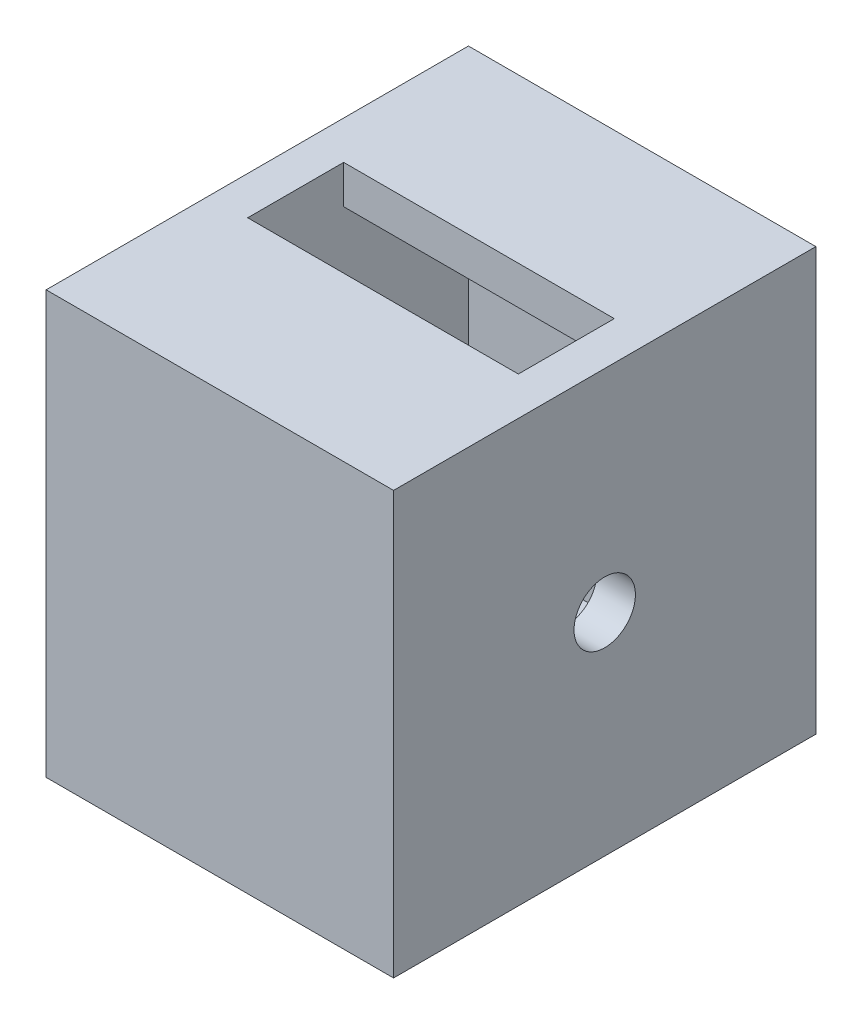
ISO-10303-21;
HEADER;
FILE_DESCRIPTION(('STEP AP214'),'2;1');
FILE_NAME('part.step','',(''),(''),'','','');
FILE_SCHEMA(('AUTOMOTIVE_DESIGN { 1 0 10303 214 1 1 1 1 }'));
ENDSEC;
DATA;
#1=APPLICATION_CONTEXT('core data for automotive mechanical design processes');
#2=APPLICATION_PROTOCOL_DEFINITION('international standard','automotive_design',2000,#1);
#3=PRODUCT_CONTEXT('',#1,'mechanical');
#4=PRODUCT('Part','Part','',(#3));
#5=PRODUCT_RELATED_PRODUCT_CATEGORY('part','',(#4));
#6=PRODUCT_DEFINITION_FORMATION('','',#4);
#7=PRODUCT_DEFINITION_CONTEXT('part definition',#1,'design');
#8=PRODUCT_DEFINITION('design','',#6,#7);
#9=PRODUCT_DEFINITION_SHAPE('','',#8);
#10=(LENGTH_UNIT() NAMED_UNIT(*) SI_UNIT(.MILLI.,.METRE.));
#11=(NAMED_UNIT(*) PLANE_ANGLE_UNIT() SI_UNIT($,.RADIAN.));
#12=(NAMED_UNIT(*) SI_UNIT($,.STERADIAN.) SOLID_ANGLE_UNIT());
#13=UNCERTAINTY_MEASURE_WITH_UNIT(LENGTH_MEASURE(1.E-05),#10,'distance_accuracy_value','');
#14=(GEOMETRIC_REPRESENTATION_CONTEXT(3) GLOBAL_UNCERTAINTY_ASSIGNED_CONTEXT((#13)) GLOBAL_UNIT_ASSIGNED_CONTEXT((#10,
#11,#12)) REPRESENTATION_CONTEXT('',''));
#15=CARTESIAN_POINT('',(0.,0.,0.));
#16=DIRECTION('',(0.,0.,1.));
#17=DIRECTION('',(1.,0.,0.));
#18=AXIS2_PLACEMENT_3D('',#15,#16,#17);
#19=CARTESIAN_POINT('',(8.9535,13.97,-11.43));
#20=DIRECTION('',(0.,0.,1.));
#21=DIRECTION('',(1.,0.,0.));
#22=AXIS2_PLACEMENT_3D('',#19,#20,#21);
#23=PLANE('',#22);
#24=DIRECTION('',(0.,1.,0.));
#25=VECTOR('',#24,1.);
#26=CARTESIAN_POINT('',(2.6035,-3.17499999999999,-11.43));
#27=LINE('',#26,#25);
#28=CARTESIAN_POINT('',(2.6035,-3.17499999999999,-11.43));
#29=VERTEX_POINT('',#28);
#30=CARTESIAN_POINT('',(2.6035,3.17500000000001,-11.43));
#31=VERTEX_POINT('',#30);
#32=EDGE_CURVE('E174',#29,#31,#27,.T.);
#33=ORIENTED_EDGE('',*,*,#32,.T.);
#34=DIRECTION('',(-1.,0.,0.));
#35=VECTOR('',#34,1.);
#36=CARTESIAN_POINT('',(5.7785,3.17500000000001,-11.43));
#37=LINE('',#36,#35);
#38=CARTESIAN_POINT('',(5.7785,3.17500000000001,-11.43));
#39=VERTEX_POINT('',#38);
#40=EDGE_CURVE('E158',#39,#31,#37,.T.);
#41=ORIENTED_EDGE('',*,*,#40,.F.);
#42=DIRECTION('',(0.,1.,0.));
#43=VECTOR('',#42,1.);
#44=CARTESIAN_POINT('',(5.7785,-3.17499999999999,-11.43));
#45=LINE('',#44,#43);
#46=CARTESIAN_POINT('',(5.7785,-3.17499999999999,-11.43));
#47=VERTEX_POINT('',#46);
#48=EDGE_CURVE('E170',#47,#39,#45,.T.);
#49=ORIENTED_EDGE('',*,*,#48,.F.);
#50=DIRECTION('',(-1.,0.,0.));
#51=VECTOR('',#50,1.);
#52=CARTESIAN_POINT('',(5.7785,-3.17499999999999,-11.43));
#53=LINE('',#52,#51);
#54=EDGE_CURVE('E182',#47,#29,#53,.T.);
#55=ORIENTED_EDGE('',*,*,#54,.T.);
#56=EDGE_LOOP('',(#33,#41,#49,#55));
#57=FACE_BOUND('',#56,.T.);
#58=DIRECTION('',(0.,-1.,0.));
#59=VECTOR('',#58,1.);
#60=CARTESIAN_POINT('',(8.9535,13.97,-11.43));
#61=LINE('',#60,#59);
#62=CARTESIAN_POINT('',(8.9535,11.43,-11.43));
#63=VERTEX_POINT('',#62);
#64=CARTESIAN_POINT('',(8.9535,-11.43,-11.43));
#65=VERTEX_POINT('',#64);
#66=EDGE_CURVE('E288',#63,#65,#61,.T.);
#67=ORIENTED_EDGE('',*,*,#66,.F.);
#68=DIRECTION('',(-1.,0.,0.));
#69=VECTOR('',#68,1.);
#70=CARTESIAN_POINT('',(-8.9535,11.43,-11.43));
#71=LINE('',#70,#69);
#72=CARTESIAN_POINT('',(-8.9535,11.43,-11.43));
#73=VERTEX_POINT('',#72);
#74=EDGE_CURVE('E244',#63,#73,#71,.T.);
#75=ORIENTED_EDGE('',*,*,#74,.T.);
#76=DIRECTION('',(0.,-1.,0.));
#77=VECTOR('',#76,1.);
#78=CARTESIAN_POINT('',(-8.9535,13.97,-11.43));
#79=LINE('',#78,#77);
#80=CARTESIAN_POINT('',(-8.9535,-11.43,-11.43));
#81=VERTEX_POINT('',#80);
#82=EDGE_CURVE('E285',#73,#81,#79,.T.);
#83=ORIENTED_EDGE('',*,*,#82,.T.);
#84=DIRECTION('',(1.,0.,0.));
#85=VECTOR('',#84,1.);
#86=CARTESIAN_POINT('',(-8.9535,-11.43,-11.43));
#87=LINE('',#86,#85);
#88=EDGE_CURVE('E261',#81,#65,#87,.T.);
#89=ORIENTED_EDGE('',*,*,#88,.T.);
#90=EDGE_LOOP('',(#67,#75,#83,#89));
#91=FACE_BOUND('',#90,.T.);
#92=ADVANCED_FACE('F43',(#57,#91),#23,.T.);
#93=CARTESIAN_POINT('',(8.9535,13.97,-11.43));
#94=DIRECTION('',(-1.,0.,0.));
#95=DIRECTION('',(0.,0.,1.));
#96=AXIS2_PLACEMENT_3D('',#93,#94,#95);
#97=PLANE('',#96);
#98=CARTESIAN_POINT('',(8.9535,0.,0.));
#99=DIRECTION('',(-1.,0.,0.));
#100=DIRECTION('',(0.,0.,1.));
#101=AXIS2_PLACEMENT_3D('',#98,#99,#100);
#102=CIRCLE('',#101,2.032);
#103=CARTESIAN_POINT('',(8.9535,0.,2.03199999999999));
#104=VERTEX_POINT('',#103);
#105=EDGE_CURVE('E205',#104,#104,#102,.F.);
#106=ORIENTED_EDGE('',*,*,#105,.T.);
#107=EDGE_LOOP('',(#106));
#108=FACE_BOUND('',#107,.T.);
#109=DIRECTION('',(0.,1.,0.));
#110=VECTOR('',#109,1.);
#111=CARTESIAN_POINT('',(8.9535,11.43,3.175));
#112=LINE('',#111,#110);
#113=CARTESIAN_POINT('',(8.9535,11.43,3.175));
#114=VERTEX_POINT('',#113);
#115=CARTESIAN_POINT('',(8.9535,13.97,3.175));
#116=VERTEX_POINT('',#115);
#117=EDGE_CURVE('E210',#114,#116,#112,.T.);
#118=ORIENTED_EDGE('',*,*,#117,.T.);
#119=DIRECTION('',(0.,0.,-1.));
#120=VECTOR('',#119,1.);
#121=CARTESIAN_POINT('',(8.9535,13.97,-11.43));
#122=LINE('',#121,#120);
#123=CARTESIAN_POINT('',(8.9535,13.97,-3.175));
#124=VERTEX_POINT('',#123);
#125=EDGE_CURVE('E273',#116,#124,#122,.T.);
#126=ORIENTED_EDGE('',*,*,#125,.T.);
#127=DIRECTION('',(0.,1.,0.));
#128=VECTOR('',#127,1.);
#129=CARTESIAN_POINT('',(8.9535,11.43,-3.175));
#130=LINE('',#129,#128);
#131=CARTESIAN_POINT('',(8.9535,11.43,-3.175));
#132=VERTEX_POINT('',#131);
#133=EDGE_CURVE('E251',#132,#124,#130,.T.);
#134=ORIENTED_EDGE('',*,*,#133,.F.);
#135=DIRECTION('',(0.,0.,-1.));
#136=VECTOR('',#135,1.);
#137=CARTESIAN_POINT('',(8.9535,11.43,-11.43));
#138=LINE('',#137,#136);
#139=EDGE_CURVE('E241',#132,#63,#138,.T.);
#140=ORIENTED_EDGE('',*,*,#139,.T.);
#141=ORIENTED_EDGE('',*,*,#66,.T.);
#142=DIRECTION('',(0.,0.,1.));
#143=VECTOR('',#142,1.);
#144=CARTESIAN_POINT('',(8.9535,-11.43,11.43));
#145=LINE('',#144,#143);
#146=CARTESIAN_POINT('',(8.9535,-11.43,11.43));
#147=VERTEX_POINT('',#146);
#148=EDGE_CURVE('E265',#65,#147,#145,.T.);
#149=ORIENTED_EDGE('',*,*,#148,.T.);
#150=DIRECTION('',(0.,-1.,0.));
#151=VECTOR('',#150,1.);
#152=CARTESIAN_POINT('',(8.9535,13.97,11.43));
#153=LINE('',#152,#151);
#154=CARTESIAN_POINT('',(8.9535,11.43,11.43));
#155=VERTEX_POINT('',#154);
#156=EDGE_CURVE('E279',#155,#147,#153,.T.);
#157=ORIENTED_EDGE('',*,*,#156,.F.);
#158=DIRECTION('',(0.,0.,-1.));
#159=VECTOR('',#158,1.);
#160=CARTESIAN_POINT('',(8.9535,11.43,11.43));
#161=LINE('',#160,#159);
#162=EDGE_CURVE('E226',#155,#114,#161,.T.);
#163=ORIENTED_EDGE('',*,*,#162,.T.);
#164=EDGE_LOOP('',(#118,#126,#134,#140,#141,#149,#157,#163));
#165=FACE_BOUND('',#164,.T.);
#166=ADVANCED_FACE('F356',(#108,#165),#97,.T.);
#167=CARTESIAN_POINT('',(-8.9535,13.97,-11.43));
#168=DIRECTION('',(1.,0.,0.));
#169=DIRECTION('',(0.,0.,-1.));
#170=AXIS2_PLACEMENT_3D('',#167,#168,#169);
#171=PLANE('',#170);
#172=DIRECTION('',(0.,1.,0.));
#173=VECTOR('',#172,1.);
#174=CARTESIAN_POINT('',(-8.9535,11.43,3.175));
#175=LINE('',#174,#173);
#176=CARTESIAN_POINT('',(-8.9535,11.43,3.175));
#177=VERTEX_POINT('',#176);
#178=CARTESIAN_POINT('',(-8.9535,13.97,3.175));
#179=VERTEX_POINT('',#178);
#180=EDGE_CURVE('E209',#177,#179,#175,.T.);
#181=ORIENTED_EDGE('',*,*,#180,.F.);
#182=DIRECTION('',(0.,0.,1.));
#183=VECTOR('',#182,1.);
#184=CARTESIAN_POINT('',(-8.9535,11.43,11.43));
#185=LINE('',#184,#183);
#186=CARTESIAN_POINT('',(-8.9535,11.43,11.43));
#187=VERTEX_POINT('',#186);
#188=EDGE_CURVE('E222',#177,#187,#185,.T.);
#189=ORIENTED_EDGE('',*,*,#188,.T.);
#190=DIRECTION('',(0.,-1.,0.));
#191=VECTOR('',#190,1.);
#192=CARTESIAN_POINT('',(-8.9535,13.97,11.43));
#193=LINE('',#192,#191);
#194=CARTESIAN_POINT('',(-8.9535,-11.43,11.43));
#195=VERTEX_POINT('',#194);
#196=EDGE_CURVE('E282',#187,#195,#193,.T.);
#197=ORIENTED_EDGE('',*,*,#196,.T.);
#198=DIRECTION('',(0.,0.,-1.));
#199=VECTOR('',#198,1.);
#200=CARTESIAN_POINT('',(-8.9535,-11.43,11.43));
#201=LINE('',#200,#199);
#202=EDGE_CURVE('E255',#195,#81,#201,.T.);
#203=ORIENTED_EDGE('',*,*,#202,.T.);
#204=ORIENTED_EDGE('',*,*,#82,.F.);
#205=DIRECTION('',(0.,0.,1.));
#206=VECTOR('',#205,1.);
#207=CARTESIAN_POINT('',(-8.9535,11.43,-11.43));
#208=LINE('',#207,#206);
#209=CARTESIAN_POINT('',(-8.9535,11.43,-3.175));
#210=VERTEX_POINT('',#209);
#211=EDGE_CURVE('E234',#73,#210,#208,.T.);
#212=ORIENTED_EDGE('',*,*,#211,.T.);
#213=DIRECTION('',(0.,1.,0.));
#214=VECTOR('',#213,1.);
#215=CARTESIAN_POINT('',(-8.9535,11.43,-3.175));
#216=LINE('',#215,#214);
#217=CARTESIAN_POINT('',(-8.9535,13.97,-3.175));
#218=VERTEX_POINT('',#217);
#219=EDGE_CURVE('E247',#210,#218,#216,.T.);
#220=ORIENTED_EDGE('',*,*,#219,.T.);
#221=DIRECTION('',(0.,0.,1.));
#222=VECTOR('',#221,1.);
#223=CARTESIAN_POINT('',(-8.9535,13.97,-11.43));
#224=LINE('',#223,#222);
#225=EDGE_CURVE('E276',#218,#179,#224,.T.);
#226=ORIENTED_EDGE('',*,*,#225,.T.);
#227=EDGE_LOOP('',(#181,#189,#197,#203,#204,#212,#220,#226));
#228=FACE_BOUND('',#227,.T.);
#229=ADVANCED_FACE('F361',(#228),#171,.T.);
#230=CARTESIAN_POINT('',(8.9535,13.97,11.43));
#231=DIRECTION('',(0.,0.,-1.));
#232=DIRECTION('',(-1.,0.,0.));
#233=AXIS2_PLACEMENT_3D('',#230,#231,#232);
#234=PLANE('',#233);
#235=DIRECTION('',(1.,0.,0.));
#236=VECTOR('',#235,1.);
#237=CARTESIAN_POINT('',(-8.9535,11.43,11.43));
#238=LINE('',#237,#236);
#239=EDGE_CURVE('E229',#187,#155,#238,.T.);
#240=ORIENTED_EDGE('',*,*,#239,.T.);
#241=ORIENTED_EDGE('',*,*,#156,.T.);
#242=DIRECTION('',(-1.,0.,0.));
#243=VECTOR('',#242,1.);
#244=CARTESIAN_POINT('',(-8.9535,-11.43,11.43));
#245=LINE('',#244,#243);
#246=EDGE_CURVE('E269',#147,#195,#245,.T.);
#247=ORIENTED_EDGE('',*,*,#246,.T.);
#248=ORIENTED_EDGE('',*,*,#196,.F.);
#249=EDGE_LOOP('',(#240,#241,#247,#248));
#250=FACE_BOUND('',#249,.T.);
#251=ADVANCED_FACE('F369',(#250),#234,.T.);
#252=CARTESIAN_POINT('',(0.,13.97,0.));
#253=DIRECTION('',(0.,-1.,0.));
#254=DIRECTION('',(0.,0.,-1.));
#255=AXIS2_PLACEMENT_3D('',#252,#253,#254);
#256=PLANE('',#255);
#257=ORIENTED_EDGE('',*,*,#125,.F.);
#258=DIRECTION('',(-1.,0.,0.));
#259=VECTOR('',#258,1.);
#260=CARTESIAN_POINT('',(-8.9535,13.97,3.175));
#261=LINE('',#260,#259);
#262=EDGE_CURVE('E217',#116,#179,#261,.T.);
#263=ORIENTED_EDGE('',*,*,#262,.T.);
#264=ORIENTED_EDGE('',*,*,#225,.F.);
#265=DIRECTION('',(1.,0.,0.));
#266=VECTOR('',#265,1.);
#267=CARTESIAN_POINT('',(-8.9535,13.97,-3.175));
#268=LINE('',#267,#266);
#269=EDGE_CURVE('E221',#218,#124,#268,.T.);
#270=ORIENTED_EDGE('',*,*,#269,.T.);
#271=EDGE_LOOP('',(#257,#263,#264,#270));
#272=FACE_BOUND('',#271,.T.);
#273=DIRECTION('',(0.,0.,-1.));
#274=VECTOR('',#273,1.);
#275=CARTESIAN_POINT('',(11.4935,13.97,-13.97));
#276=LINE('',#275,#274);
#277=CARTESIAN_POINT('',(11.4935,13.97,13.97));
#278=VERTEX_POINT('',#277);
#279=CARTESIAN_POINT('',(11.4935,13.97,-13.97));
#280=VERTEX_POINT('',#279);
#281=EDGE_CURVE('E292',#278,#280,#276,.T.);
#282=ORIENTED_EDGE('',*,*,#281,.T.);
#283=DIRECTION('',(-1.,0.,0.));
#284=VECTOR('',#283,1.);
#285=CARTESIAN_POINT('',(11.4935,13.97,-13.97));
#286=LINE('',#285,#284);
#287=CARTESIAN_POINT('',(-11.4935,13.97,-13.97));
#288=VERTEX_POINT('',#287);
#289=EDGE_CURVE('E296',#280,#288,#286,.T.);
#290=ORIENTED_EDGE('',*,*,#289,.T.);
#291=DIRECTION('',(0.,0.,1.));
#292=VECTOR('',#291,1.);
#293=CARTESIAN_POINT('',(-11.4935,13.97,-13.97));
#294=LINE('',#293,#292);
#295=CARTESIAN_POINT('',(-11.4935,13.97,13.97));
#296=VERTEX_POINT('',#295);
#297=EDGE_CURVE('E300',#288,#296,#294,.T.);
#298=ORIENTED_EDGE('',*,*,#297,.T.);
#299=DIRECTION('',(1.,0.,0.));
#300=VECTOR('',#299,1.);
#301=CARTESIAN_POINT('',(11.4935,13.97,13.97));
#302=LINE('',#301,#300);
#303=EDGE_CURVE('E303',#296,#278,#302,.T.);
#304=ORIENTED_EDGE('',*,*,#303,.T.);
#305=EDGE_LOOP('',(#282,#290,#298,#304));
#306=FACE_BOUND('',#305,.T.);
#307=ADVANCED_FACE('F345',(#272,#306),#256,.F.);
#308=CARTESIAN_POINT('',(0.,-13.97,0.));
#309=DIRECTION('',(0.,-1.,0.));
#310=DIRECTION('',(0.,0.,-1.));
#311=AXIS2_PLACEMENT_3D('',#308,#309,#310);
#312=PLANE('',#311);
#313=DIRECTION('',(0.,0.,-1.));
#314=VECTOR('',#313,1.);
#315=CARTESIAN_POINT('',(11.4935,-13.97,-13.97));
#316=LINE('',#315,#314);
#317=CARTESIAN_POINT('',(11.4935,-13.97,13.97));
#318=VERTEX_POINT('',#317);
#319=CARTESIAN_POINT('',(11.4935,-13.97,-13.97));
#320=VERTEX_POINT('',#319);
#321=EDGE_CURVE('E291',#318,#320,#316,.T.);
#322=ORIENTED_EDGE('',*,*,#321,.F.);
#323=DIRECTION('',(1.,0.,0.));
#324=VECTOR('',#323,1.);
#325=CARTESIAN_POINT('',(11.4935,-13.97,13.97));
#326=LINE('',#325,#324);
#327=CARTESIAN_POINT('',(-11.4935,-13.97,13.97));
#328=VERTEX_POINT('',#327);
#329=EDGE_CURVE('E297',#328,#318,#326,.T.);
#330=ORIENTED_EDGE('',*,*,#329,.F.);
#331=DIRECTION('',(0.,0.,1.));
#332=VECTOR('',#331,1.);
#333=CARTESIAN_POINT('',(-11.4935,-13.97,-13.97));
#334=LINE('',#333,#332);
#335=CARTESIAN_POINT('',(-11.4935,-13.97,-13.97));
#336=VERTEX_POINT('',#335);
#337=EDGE_CURVE('E313',#336,#328,#334,.T.);
#338=ORIENTED_EDGE('',*,*,#337,.F.);
#339=DIRECTION('',(-1.,0.,0.));
#340=VECTOR('',#339,1.);
#341=CARTESIAN_POINT('',(11.4935,-13.97,-13.97));
#342=LINE('',#341,#340);
#343=EDGE_CURVE('E310',#320,#336,#342,.T.);
#344=ORIENTED_EDGE('',*,*,#343,.F.);
#345=EDGE_LOOP('',(#322,#330,#338,#344));
#346=FACE_BOUND('',#345,.T.);
#347=ADVANCED_FACE('F336',(#346),#312,.T.);
#348=CARTESIAN_POINT('',(11.4935,13.97,-13.97));
#349=DIRECTION('',(-1.,0.,0.));
#350=DIRECTION('',(0.,0.,1.));
#351=AXIS2_PLACEMENT_3D('',#348,#349,#350);
#352=PLANE('',#351);
#353=CARTESIAN_POINT('',(11.4935,0.,0.));
#354=DIRECTION('',(1.,0.,0.));
#355=DIRECTION('',(0.,0.,-1.));
#356=AXIS2_PLACEMENT_3D('',#353,#354,#355);
#357=CIRCLE('',#356,2.032);
#358=CARTESIAN_POINT('',(11.4935,0.,-2.03200000000001));
#359=VERTEX_POINT('',#358);
#360=EDGE_CURVE('E201',#359,#359,#357,.T.);
#361=ORIENTED_EDGE('',*,*,#360,.F.);
#362=EDGE_LOOP('',(#361));
#363=FACE_BOUND('',#362,.T.);
#364=ORIENTED_EDGE('',*,*,#321,.T.);
#365=DIRECTION('',(0.,-1.,0.));
#366=VECTOR('',#365,1.);
#367=CARTESIAN_POINT('',(11.4935,13.97,-13.97));
#368=LINE('',#367,#366);
#369=EDGE_CURVE('E11',#280,#320,#368,.T.);
#370=ORIENTED_EDGE('',*,*,#369,.F.);
#371=ORIENTED_EDGE('',*,*,#281,.F.);
#372=DIRECTION('',(0.,-1.,0.));
#373=VECTOR('',#372,1.);
#374=CARTESIAN_POINT('',(11.4935,13.97,13.97));
#375=LINE('',#374,#373);
#376=EDGE_CURVE('E306',#278,#318,#375,.T.);
#377=ORIENTED_EDGE('',*,*,#376,.T.);
#378=EDGE_LOOP('',(#364,#370,#371,#377));
#379=FACE_BOUND('',#378,.T.);
#380=ADVANCED_FACE('F45',(#363,#379),#352,.F.);
#381=CARTESIAN_POINT('',(11.4935,13.97,-13.97));
#382=DIRECTION('',(0.,0.,1.));
#383=DIRECTION('',(1.,0.,0.));
#384=AXIS2_PLACEMENT_3D('',#381,#382,#383);
#385=PLANE('',#384);
#386=DIRECTION('',(-1.,0.,0.));
#387=VECTOR('',#386,1.);
#388=CARTESIAN_POINT('',(5.7785,3.17500000000001,-13.97));
#389=LINE('',#388,#387);
#390=CARTESIAN_POINT('',(5.7785,3.17500000000001,-13.97));
#391=VERTEX_POINT('',#390);
#392=CARTESIAN_POINT('',(2.6035,3.17500000000001,-13.97));
#393=VERTEX_POINT('',#392);
#394=EDGE_CURVE('E196',#391,#393,#389,.T.);
#395=ORIENTED_EDGE('',*,*,#394,.T.);
#396=DIRECTION('',(0.,1.,0.));
#397=VECTOR('',#396,1.);
#398=CARTESIAN_POINT('',(2.6035,-3.17499999999999,-13.97));
#399=LINE('',#398,#397);
#400=CARTESIAN_POINT('',(2.6035,-3.17499999999999,-13.97));
#401=VERTEX_POINT('',#400);
#402=EDGE_CURVE('E177',#401,#393,#399,.T.);
#403=ORIENTED_EDGE('',*,*,#402,.F.);
#404=DIRECTION('',(-1.,0.,0.));
#405=VECTOR('',#404,1.);
#406=CARTESIAN_POINT('',(5.7785,-3.17499999999999,-13.97));
#407=LINE('',#406,#405);
#408=CARTESIAN_POINT('',(5.7785,-3.17499999999999,-13.97));
#409=VERTEX_POINT('',#408);
#410=EDGE_CURVE('E169',#409,#401,#407,.T.);
#411=ORIENTED_EDGE('',*,*,#410,.F.);
#412=DIRECTION('',(0.,1.,0.));
#413=VECTOR('',#412,1.);
#414=CARTESIAN_POINT('',(5.7785,-3.17499999999999,-13.97));
#415=LINE('',#414,#413);
#416=EDGE_CURVE('E67',#409,#391,#415,.T.);
#417=ORIENTED_EDGE('',*,*,#416,.T.);
#418=EDGE_LOOP('',(#395,#403,#411,#417));
#419=FACE_BOUND('',#418,.T.);
#420=ORIENTED_EDGE('',*,*,#343,.T.);
#421=DIRECTION('',(0.,-1.,0.));
#422=VECTOR('',#421,1.);
#423=CARTESIAN_POINT('',(-11.4935,13.97,-13.97));
#424=LINE('',#423,#422);
#425=EDGE_CURVE('E52',#288,#336,#424,.T.);
#426=ORIENTED_EDGE('',*,*,#425,.F.);
#427=ORIENTED_EDGE('',*,*,#289,.F.);
#428=ORIENTED_EDGE('',*,*,#369,.T.);
#429=EDGE_LOOP('',(#420,#426,#427,#428));
#430=FACE_BOUND('',#429,.T.);
#431=ADVANCED_FACE('F346',(#419,#430),#385,.F.);
#432=CARTESIAN_POINT('',(-11.4935,13.97,-13.97));
#433=DIRECTION('',(1.,0.,0.));
#434=DIRECTION('',(0.,0.,-1.));
#435=AXIS2_PLACEMENT_3D('',#432,#433,#434);
#436=PLANE('',#435);
#437=ORIENTED_EDGE('',*,*,#337,.T.);
#438=DIRECTION('',(0.,-1.,0.));
#439=VECTOR('',#438,1.);
#440=CARTESIAN_POINT('',(-11.4935,13.97,13.97));
#441=LINE('',#440,#439);
#442=EDGE_CURVE('E321',#296,#328,#441,.T.);
#443=ORIENTED_EDGE('',*,*,#442,.F.);
#444=ORIENTED_EDGE('',*,*,#297,.F.);
#445=ORIENTED_EDGE('',*,*,#425,.T.);
#446=EDGE_LOOP('',(#437,#443,#444,#445));
#447=FACE_BOUND('',#446,.T.);
#448=ADVANCED_FACE('F330',(#447),#436,.F.);
#449=CARTESIAN_POINT('',(11.4935,13.97,13.97));
#450=DIRECTION('',(0.,0.,-1.));
#451=DIRECTION('',(-1.,0.,0.));
#452=AXIS2_PLACEMENT_3D('',#449,#450,#451);
#453=PLANE('',#452);
#454=ORIENTED_EDGE('',*,*,#329,.T.);
#455=ORIENTED_EDGE('',*,*,#376,.F.);
#456=ORIENTED_EDGE('',*,*,#303,.F.);
#457=ORIENTED_EDGE('',*,*,#442,.T.);
#458=EDGE_LOOP('',(#454,#455,#456,#457));
#459=FACE_BOUND('',#458,.T.);
#460=ADVANCED_FACE('F339',(#459),#453,.F.);
#461=CARTESIAN_POINT('',(0.,-11.43,0.));
#462=DIRECTION('',(0.,-1.,0.));
#463=DIRECTION('',(0.,0.,-1.));
#464=AXIS2_PLACEMENT_3D('',#461,#462,#463);
#465=PLANE('',#464);
#466=ORIENTED_EDGE('',*,*,#202,.F.);
#467=ORIENTED_EDGE('',*,*,#246,.F.);
#468=ORIENTED_EDGE('',*,*,#148,.F.);
#469=ORIENTED_EDGE('',*,*,#88,.F.);
#470=EDGE_LOOP('',(#466,#467,#468,#469));
#471=FACE_BOUND('',#470,.T.);
#472=ADVANCED_FACE('F374',(#471),#465,.F.);
#473=CARTESIAN_POINT('',(-8.9535,11.43,-3.175));
#474=DIRECTION('',(0.,0.,1.));
#475=DIRECTION('',(1.,0.,0.));
#476=AXIS2_PLACEMENT_3D('',#473,#474,#475);
#477=PLANE('',#476);
#478=ORIENTED_EDGE('',*,*,#269,.F.);
#479=ORIENTED_EDGE('',*,*,#219,.F.);
#480=DIRECTION('',(1.,0.,0.));
#481=VECTOR('',#480,1.);
#482=CARTESIAN_POINT('',(-8.9535,11.43,-3.175));
#483=LINE('',#482,#481);
#484=EDGE_CURVE('E237',#210,#132,#483,.T.);
#485=ORIENTED_EDGE('',*,*,#484,.T.);
#486=ORIENTED_EDGE('',*,*,#133,.T.);
#487=EDGE_LOOP('',(#478,#479,#485,#486));
#488=FACE_BOUND('',#487,.T.);
#489=ADVANCED_FACE('F378',(#488),#477,.T.);
#490=CARTESIAN_POINT('',(0.,11.43,0.));
#491=DIRECTION('',(0.,1.,0.));
#492=DIRECTION('',(0.,0.,1.));
#493=AXIS2_PLACEMENT_3D('',#490,#491,#492);
#494=PLANE('',#493);
#495=ORIENTED_EDGE('',*,*,#211,.F.);
#496=ORIENTED_EDGE('',*,*,#74,.F.);
#497=ORIENTED_EDGE('',*,*,#139,.F.);
#498=ORIENTED_EDGE('',*,*,#484,.F.);
#499=EDGE_LOOP('',(#495,#496,#497,#498));
#500=FACE_BOUND('',#499,.T.);
#501=ADVANCED_FACE('F384',(#500),#494,.F.);
#502=CARTESIAN_POINT('',(-8.9535,11.43,3.175));
#503=DIRECTION('',(0.,0.,-1.));
#504=DIRECTION('',(-1.,0.,0.));
#505=AXIS2_PLACEMENT_3D('',#502,#503,#504);
#506=PLANE('',#505);
#507=ORIENTED_EDGE('',*,*,#262,.F.);
#508=ORIENTED_EDGE('',*,*,#117,.F.);
#509=DIRECTION('',(-1.,0.,0.));
#510=VECTOR('',#509,1.);
#511=CARTESIAN_POINT('',(-8.9535,11.43,3.175));
#512=LINE('',#511,#510);
#513=EDGE_CURVE('E213',#114,#177,#512,.T.);
#514=ORIENTED_EDGE('',*,*,#513,.T.);
#515=ORIENTED_EDGE('',*,*,#180,.T.);
#516=EDGE_LOOP('',(#507,#508,#514,#515));
#517=FACE_BOUND('',#516,.T.);
#518=ADVANCED_FACE('F409',(#517),#506,.T.);
#519=CARTESIAN_POINT('',(0.,11.43,0.));
#520=DIRECTION('',(0.,-1.,0.));
#521=DIRECTION('',(0.,0.,-1.));
#522=AXIS2_PLACEMENT_3D('',#519,#520,#521);
#523=PLANE('',#522);
#524=ORIENTED_EDGE('',*,*,#188,.F.);
#525=ORIENTED_EDGE('',*,*,#513,.F.);
#526=ORIENTED_EDGE('',*,*,#162,.F.);
#527=ORIENTED_EDGE('',*,*,#239,.F.);
#528=EDGE_LOOP('',(#524,#525,#526,#527));
#529=FACE_BOUND('',#528,.T.);
#530=ADVANCED_FACE('F406',(#529),#523,.T.);
#531=CARTESIAN_POINT('',(3.20613608251575,0.,0.));
#532=DIRECTION('',(1.,0.,0.));
#533=DIRECTION('',(0.,0.,-1.));
#534=AXIS2_PLACEMENT_3D('',#531,#532,#533);
#535=CYLINDRICAL_SURFACE('',#534,2.032);
#536=ORIENTED_EDGE('',*,*,#360,.T.);
#537=EDGE_LOOP('',(#536));
#538=FACE_BOUND('',#537,.T.);
#539=ORIENTED_EDGE('',*,*,#105,.F.);
#540=EDGE_LOOP('',(#539));
#541=FACE_BOUND('',#540,.T.);
#542=ADVANCED_FACE('F429',(#538,#541),#535,.F.);
#543=CARTESIAN_POINT('',(2.6035,-3.17499999999999,-4.33048417143817));
#544=DIRECTION('',(-1.,0.,0.));
#545=DIRECTION('',(0.,0.,1.));
#546=AXIS2_PLACEMENT_3D('',#543,#544,#545);
#547=PLANE('',#546);
#548=DIRECTION('',(0.,0.,-1.));
#549=VECTOR('',#548,1.);
#550=CARTESIAN_POINT('',(2.6035,-3.17499999999999,-4.33048417143817));
#551=LINE('',#550,#549);
#552=EDGE_CURVE('E59',#29,#401,#551,.T.);
#553=ORIENTED_EDGE('',*,*,#552,.T.);
#554=ORIENTED_EDGE('',*,*,#402,.T.);
#555=DIRECTION('',(0.,0.,-1.));
#556=VECTOR('',#555,1.);
#557=CARTESIAN_POINT('',(2.6035,3.17500000000001,-4.33048417143817));
#558=LINE('',#557,#556);
#559=EDGE_CURVE('E162',#31,#393,#558,.T.);
#560=ORIENTED_EDGE('',*,*,#559,.F.);
#561=ORIENTED_EDGE('',*,*,#32,.F.);
#562=EDGE_LOOP('',(#553,#554,#560,#561));
#563=FACE_BOUND('',#562,.T.);
#564=ADVANCED_FACE('F173',(#563),#547,.F.);
#565=CARTESIAN_POINT('',(5.7785,3.17500000000001,-4.33048417143817));
#566=DIRECTION('',(0.,-1.,0.));
#567=DIRECTION('',(0.,0.,-1.));
#568=AXIS2_PLACEMENT_3D('',#565,#566,#567);
#569=PLANE('',#568);
#570=ORIENTED_EDGE('',*,*,#40,.T.);
#571=ORIENTED_EDGE('',*,*,#559,.T.);
#572=ORIENTED_EDGE('',*,*,#394,.F.);
#573=DIRECTION('',(0.,0.,-1.));
#574=VECTOR('',#573,1.);
#575=CARTESIAN_POINT('',(5.7785,3.17500000000001,-4.33048417143817));
#576=LINE('',#575,#574);
#577=EDGE_CURVE('E164',#39,#391,#576,.T.);
#578=ORIENTED_EDGE('',*,*,#577,.F.);
#579=EDGE_LOOP('',(#570,#571,#572,#578));
#580=FACE_BOUND('',#579,.T.);
#581=ADVANCED_FACE('F160',(#580),#569,.T.);
#582=CARTESIAN_POINT('',(5.7785,-3.17499999999999,-4.33048417143817));
#583=DIRECTION('',(-1.,0.,0.));
#584=DIRECTION('',(0.,0.,1.));
#585=AXIS2_PLACEMENT_3D('',#582,#583,#584);
#586=PLANE('',#585);
#587=ORIENTED_EDGE('',*,*,#48,.T.);
#588=ORIENTED_EDGE('',*,*,#577,.T.);
#589=ORIENTED_EDGE('',*,*,#416,.F.);
#590=DIRECTION('',(0.,0.,-1.));
#591=VECTOR('',#590,1.);
#592=CARTESIAN_POINT('',(5.7785,-3.17499999999999,-4.33048417143817));
#593=LINE('',#592,#591);
#594=EDGE_CURVE('E193',#47,#409,#593,.T.);
#595=ORIENTED_EDGE('',*,*,#594,.F.);
#596=EDGE_LOOP('',(#587,#588,#589,#595));
#597=FACE_BOUND('',#596,.T.);
#598=ADVANCED_FACE('F438',(#597),#586,.T.);
#599=CARTESIAN_POINT('',(5.7785,-3.17499999999999,-4.33048417143817));
#600=DIRECTION('',(0.,-1.,0.));
#601=DIRECTION('',(0.,0.,-1.));
#602=AXIS2_PLACEMENT_3D('',#599,#600,#601);
#603=PLANE('',#602);
#604=ORIENTED_EDGE('',*,*,#594,.T.);
#605=ORIENTED_EDGE('',*,*,#410,.T.);
#606=ORIENTED_EDGE('',*,*,#552,.F.);
#607=ORIENTED_EDGE('',*,*,#54,.F.);
#608=EDGE_LOOP('',(#604,#605,#606,#607));
#609=FACE_BOUND('',#608,.T.);
#610=ADVANCED_FACE('F441',(#609),#603,.F.);
#611=CLOSED_SHELL('',(#92,#166,#229,#251,#307,#347,#380,#431,#448,#460,#472,#489,#501,#518,#530,
#542,#564,#581,#598,#610));
#612=MANIFOLD_SOLID_BREP('B2',#611);
#613=ADVANCED_BREP_SHAPE_REPRESENTATION('',(#18,#612),#14);
#614=SHAPE_DEFINITION_REPRESENTATION(#9,#613);
ENDSEC;
END-ISO-10303-21;
